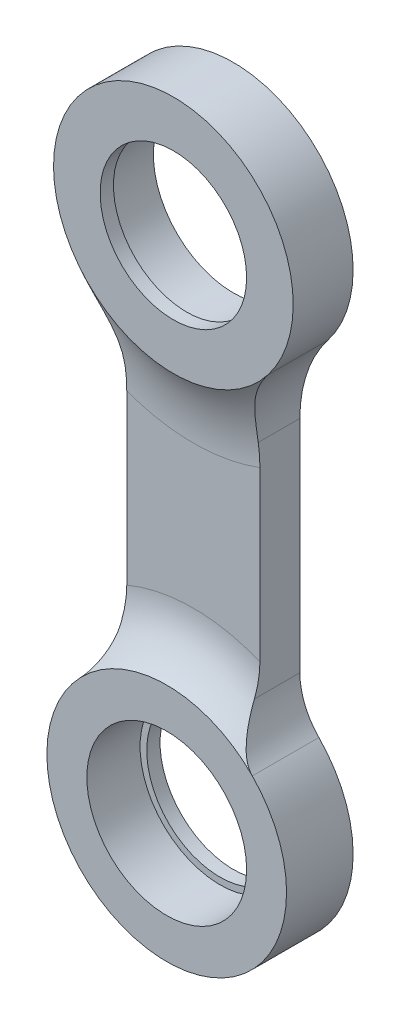
ISO-10303-21;
HEADER;
FILE_DESCRIPTION(('STEP AP214'),'2;1');
FILE_NAME('part.step','',(''),(''),'','','');
FILE_SCHEMA(('AUTOMOTIVE_DESIGN { 1 0 10303 214 1 1 1 1 }'));
ENDSEC;
DATA;
#1=APPLICATION_CONTEXT('core data for automotive mechanical design processes');
#2=APPLICATION_PROTOCOL_DEFINITION('international standard','automotive_design',2000,#1);
#3=PRODUCT_CONTEXT('',#1,'mechanical');
#4=PRODUCT('Part','Part','',(#3));
#5=PRODUCT_RELATED_PRODUCT_CATEGORY('part','',(#4));
#6=PRODUCT_DEFINITION_FORMATION('','',#4);
#7=PRODUCT_DEFINITION_CONTEXT('part definition',#1,'design');
#8=PRODUCT_DEFINITION('design','',#6,#7);
#9=PRODUCT_DEFINITION_SHAPE('','',#8);
#10=(LENGTH_UNIT() NAMED_UNIT(*) SI_UNIT(.MILLI.,.METRE.));
#11=(NAMED_UNIT(*) PLANE_ANGLE_UNIT() SI_UNIT($,.RADIAN.));
#12=(NAMED_UNIT(*) SI_UNIT($,.STERADIAN.) SOLID_ANGLE_UNIT());
#13=UNCERTAINTY_MEASURE_WITH_UNIT(LENGTH_MEASURE(1.E-05),#10,'distance_accuracy_value','');
#14=(GEOMETRIC_REPRESENTATION_CONTEXT(3) GLOBAL_UNCERTAINTY_ASSIGNED_CONTEXT((#13)) GLOBAL_UNIT_ASSIGNED_CONTEXT((#10,
#11,#12)) REPRESENTATION_CONTEXT('',''));
#15=CARTESIAN_POINT('',(0.,0.,0.));
#16=DIRECTION('',(0.,0.,1.));
#17=DIRECTION('',(1.,0.,0.));
#18=AXIS2_PLACEMENT_3D('',#15,#16,#17);
#19=CARTESIAN_POINT('',(0.,0.,3.));
#20=DIRECTION('',(0.,0.,-1.));
#21=DIRECTION('',(-1.,0.,0.));
#22=AXIS2_PLACEMENT_3D('',#19,#20,#21);
#23=CYLINDRICAL_SURFACE('',#22,6.);
#24=CARTESIAN_POINT('',(0.,0.,0.));
#25=DIRECTION('',(0.,0.,1.));
#26=DIRECTION('',(1.,0.,0.));
#27=AXIS2_PLACEMENT_3D('',#24,#25,#26);
#28=CIRCLE('',#27,6.);
#29=CARTESIAN_POINT('',(6.,0.,0.));
#30=VERTEX_POINT('',#29);
#31=EDGE_CURVE('E267',#30,#30,#28,.T.);
#32=ORIENTED_EDGE('',*,*,#31,.F.);
#33=EDGE_LOOP('',(#32));
#34=FACE_BOUND('',#33,.T.);
#35=CARTESIAN_POINT('',(0.,0.,3.5));
#36=DIRECTION('',(0.,0.,1.));
#37=DIRECTION('',(1.,0.,0.));
#38=AXIS2_PLACEMENT_3D('',#35,#36,#37);
#39=CIRCLE('',#38,6.);
#40=CARTESIAN_POINT('',(6.,0.,3.5));
#41=VERTEX_POINT('',#40);
#42=EDGE_CURVE('E247',#41,#41,#39,.T.);
#43=ORIENTED_EDGE('',*,*,#42,.T.);
#44=EDGE_LOOP('',(#43));
#45=FACE_BOUND('',#44,.T.);
#46=ADVANCED_FACE('F37',(#34,#45),#23,.F.);
#47=CARTESIAN_POINT('',(0.,0.,3.));
#48=DIRECTION('',(0.,0.,1.));
#49=DIRECTION('',(1.,0.,0.));
#50=AXIS2_PLACEMENT_3D('',#47,#48,#49);
#51=PLANE('',#50);
#52=DIRECTION('',(0.,1.,0.));
#53=VECTOR('',#52,1.);
#54=CARTESIAN_POINT('',(5.,-7.48331477354788,3.));
#55=LINE('',#54,#53);
#56=CARTESIAN_POINT('',(5.,-26.,3.));
#57=VERTEX_POINT('',#56);
#58=CARTESIAN_POINT('',(5.,-13.3630417112151,3.));
#59=VERTEX_POINT('',#58);
#60=EDGE_CURVE('E128',#57,#59,#55,.T.);
#61=ORIENTED_EDGE('',*,*,#60,.T.);
#62=CARTESIAN_POINT('',(0.,0.,3.));
#63=DIRECTION('',(0.,0.,1.));
#64=DIRECTION('',(1.,0.,0.));
#65=AXIS2_PLACEMENT_3D('',#62,#63,#64);
#66=CIRCLE('',#65,14.2678268764264);
#67=CARTESIAN_POINT('',(-5.,-13.3630417112151,3.));
#68=VERTEX_POINT('',#67);
#69=EDGE_CURVE('E282',#59,#68,#66,.F.);
#70=ORIENTED_EDGE('',*,*,#69,.T.);
#71=DIRECTION('',(0.,-1.,0.));
#72=VECTOR('',#71,1.);
#73=CARTESIAN_POINT('',(-5.,-7.48331477354788,3.));
#74=LINE('',#73,#72);
#75=CARTESIAN_POINT('',(-5.,-26.,3.));
#76=VERTEX_POINT('',#75);
#77=EDGE_CURVE('E148',#68,#76,#74,.T.);
#78=ORIENTED_EDGE('',*,*,#77,.T.);
#79=CARTESIAN_POINT('',(0.,-38.,3.));
#80=DIRECTION('',(0.,0.,1.));
#81=DIRECTION('',(1.,0.,0.));
#82=AXIS2_PLACEMENT_3D('',#79,#80,#81);
#83=CIRCLE('',#82,13.);
#84=EDGE_CURVE('E159',#76,#57,#83,.F.);
#85=ORIENTED_EDGE('',*,*,#84,.T.);
#86=EDGE_LOOP('',(#61,#70,#78,#85));
#87=FACE_BOUND('',#86,.T.);
#88=ADVANCED_FACE('F292',(#87),#51,.T.);
#89=CARTESIAN_POINT('',(0.,-38.,0.));
#90=DIRECTION('',(0.,0.,1.));
#91=DIRECTION('',(1.,0.,0.));
#92=AXIS2_PLACEMENT_3D('',#89,#90,#91);
#93=CYLINDRICAL_SURFACE('',#92,5.5);
#94=CARTESIAN_POINT('',(0.,-38.,0.));
#95=DIRECTION('',(0.,0.,1.));
#96=DIRECTION('',(1.,0.,0.));
#97=AXIS2_PLACEMENT_3D('',#94,#95,#96);
#98=CIRCLE('',#97,5.5);
#99=CARTESIAN_POINT('',(5.5,-38.,0.));
#100=VERTEX_POINT('',#99);
#101=EDGE_CURVE('E261',#100,#100,#98,.T.);
#102=ORIENTED_EDGE('',*,*,#101,.F.);
#103=EDGE_LOOP('',(#102));
#104=FACE_BOUND('',#103,.T.);
#105=CARTESIAN_POINT('',(0.,-38.,1.));
#106=DIRECTION('',(0.,0.,1.));
#107=DIRECTION('',(1.,0.,0.));
#108=AXIS2_PLACEMENT_3D('',#105,#106,#107);
#109=CIRCLE('',#108,5.5);
#110=CARTESIAN_POINT('',(5.5,-38.,1.));
#111=VERTEX_POINT('',#110);
#112=EDGE_CURVE('E258',#111,#111,#109,.F.);
#113=ORIENTED_EDGE('',*,*,#112,.F.);
#114=EDGE_LOOP('',(#113));
#115=FACE_BOUND('',#114,.T.);
#116=ADVANCED_FACE('F290',(#104,#115),#93,.F.);
#117=CARTESIAN_POINT('',(0.,0.,0.));
#118=DIRECTION('',(0.,0.,1.));
#119=DIRECTION('',(1.,0.,0.));
#120=AXIS2_PLACEMENT_3D('',#117,#118,#119);
#121=PLANE('',#120);
#122=ORIENTED_EDGE('',*,*,#101,.T.);
#123=EDGE_LOOP('',(#122));
#124=FACE_BOUND('',#123,.T.);
#125=DIRECTION('',(0.,1.,0.));
#126=VECTOR('',#125,1.);
#127=CARTESIAN_POINT('',(5.,-7.48331477354788,0.));
#128=LINE('',#127,#126);
#129=CARTESIAN_POINT('',(5.,-28.2020410288673,0.));
#130=VERTEX_POINT('',#129);
#131=CARTESIAN_POINT('',(5.,-11.6619037896906,0.));
#132=VERTEX_POINT('',#131);
#133=EDGE_CURVE('E272',#130,#132,#128,.T.);
#134=ORIENTED_EDGE('',*,*,#133,.F.);
#135=CARTESIAN_POINT('',(10.,-28.2020410288673,0.));
#136=DIRECTION('',(0.,0.,1.));
#137=DIRECTION('',(1.,0.,0.));
#138=AXIS2_PLACEMENT_3D('',#135,#136,#137);
#139=CIRCLE('',#138,5.);
#140=CARTESIAN_POINT('',(6.42857142857143,-31.7013120899861,0.));
#141=VERTEX_POINT('',#140);
#142=EDGE_CURVE('E140',#130,#141,#139,.T.);
#143=ORIENTED_EDGE('',*,*,#142,.T.);
#144=CARTESIAN_POINT('',(0.,-38.,0.));
#145=DIRECTION('',(0.,0.,-1.));
#146=DIRECTION('',(-1.,0.,0.));
#147=AXIS2_PLACEMENT_3D('',#144,#145,#146);
#148=CIRCLE('',#147,9.);
#149=CARTESIAN_POINT('',(-6.42857142857143,-31.7013120899861,0.));
#150=VERTEX_POINT('',#149);
#151=EDGE_CURVE('E138',#141,#150,#148,.T.);
#152=ORIENTED_EDGE('',*,*,#151,.T.);
#153=CARTESIAN_POINT('',(-10.,-28.2020410288673,0.));
#154=DIRECTION('',(0.,0.,1.));
#155=DIRECTION('',(1.,0.,0.));
#156=AXIS2_PLACEMENT_3D('',#153,#154,#155);
#157=CIRCLE('',#156,5.);
#158=CARTESIAN_POINT('',(-5.,-28.2020410288673,0.));
#159=VERTEX_POINT('',#158);
#160=EDGE_CURVE('E133',#150,#159,#157,.T.);
#161=ORIENTED_EDGE('',*,*,#160,.T.);
#162=DIRECTION('',(0.,-1.,0.));
#163=VECTOR('',#162,1.);
#164=CARTESIAN_POINT('',(-5.,-7.48331477354788,0.));
#165=LINE('',#164,#163);
#166=CARTESIAN_POINT('',(-5.,-11.6619037896906,0.));
#167=VERTEX_POINT('',#166);
#168=EDGE_CURVE('E120',#167,#159,#165,.T.);
#169=ORIENTED_EDGE('',*,*,#168,.F.);
#170=CARTESIAN_POINT('',(-15.,-11.6619037896906,0.));
#171=DIRECTION('',(0.,0.,1.));
#172=DIRECTION('',(1.,0.,0.));
#173=AXIS2_PLACEMENT_3D('',#170,#171,#172);
#174=CIRCLE('',#173,10.);
#175=CARTESIAN_POINT('',(-7.10526315789474,-5.52405968985344,0.));
#176=VERTEX_POINT('',#175);
#177=EDGE_CURVE('E50',#167,#176,#174,.T.);
#178=ORIENTED_EDGE('',*,*,#177,.T.);
#179=CARTESIAN_POINT('',(0.,0.,0.));
#180=DIRECTION('',(0.,0.,1.));
#181=DIRECTION('',(1.,0.,0.));
#182=AXIS2_PLACEMENT_3D('',#179,#180,#181);
#183=CIRCLE('',#182,9.);
#184=CARTESIAN_POINT('',(7.10526315789474,-5.52405968985344,0.));
#185=VERTEX_POINT('',#184);
#186=EDGE_CURVE('E129',#185,#176,#183,.T.);
#187=ORIENTED_EDGE('',*,*,#186,.F.);
#188=CARTESIAN_POINT('',(15.,-11.6619037896906,0.));
#189=DIRECTION('',(0.,0.,1.));
#190=DIRECTION('',(1.,0.,0.));
#191=AXIS2_PLACEMENT_3D('',#188,#189,#190);
#192=CIRCLE('',#191,10.);
#193=EDGE_CURVE('E11',#185,#132,#192,.T.);
#194=ORIENTED_EDGE('',*,*,#193,.T.);
#195=EDGE_LOOP('',(#134,#143,#152,#161,#169,#178,#187,#194));
#196=FACE_BOUND('',#195,.T.);
#197=ORIENTED_EDGE('',*,*,#31,.T.);
#198=EDGE_LOOP('',(#197));
#199=FACE_BOUND('',#198,.T.);
#200=ADVANCED_FACE('F135',(#124,#196,#199),#121,.F.);
#201=CARTESIAN_POINT('',(5.,-7.48331477354788,3.));
#202=DIRECTION('',(-1.,0.,0.));
#203=DIRECTION('',(0.,-1.,0.));
#204=AXIS2_PLACEMENT_3D('',#201,#202,#203);
#205=PLANE('',#204);
#206=ORIENTED_EDGE('',*,*,#133,.T.);
#207=DIRECTION('',(0.,0.,1.));
#208=VECTOR('',#207,1.);
#209=CARTESIAN_POINT('',(5.,-11.6619037896906,3.));
#210=LINE('',#209,#208);
#211=CARTESIAN_POINT('',(5.,-11.6619037896906,3.12548879514451));
#212=VERTEX_POINT('',#211);
#213=EDGE_CURVE('E66',#132,#212,#210,.T.);
#214=ORIENTED_EDGE('',*,*,#213,.T.);
#215=CARTESIAN_POINT('',(5.,-11.6619037896906,3.12548879514451));
#216=CARTESIAN_POINT('',(5.,-11.8027534116254,3.1047832327524));
#217=CARTESIAN_POINT('',(5.,-11.9439735407425,3.0865795793301));
#218=CARTESIAN_POINT('',(5.,-12.2267889504772,3.05528907455919));
#219=CARTESIAN_POINT('',(5.,-12.3683834822832,3.04219544968718));
#220=CARTESIAN_POINT('',(5.,-12.6519625143613,3.02118205097603));
#221=CARTESIAN_POINT('',(5.,-12.793947028353,3.0132624615626));
#222=CARTESIAN_POINT('',(5.,-13.0783005396914,3.00266703155814));
#223=CARTESIAN_POINT('',(5.,-13.2206697972569,2.99999818906772));
#224=CARTESIAN_POINT('',(5.,-13.3630417112151,3.));
#225=B_SPLINE_CURVE_WITH_KNOTS('',3,(#215,#216,#217,#218,#219,#220,#221,#222,#223,#224),
.UNSPECIFIED.,.F.,.F.,(4,2,2,2,4),(0.,0.427071647913648,0.853575258761427,1.28009407127177,
1.70718095629201),.UNSPECIFIED.);
#226=EDGE_CURVE('E207',#212,#59,#225,.T.);
#227=ORIENTED_EDGE('',*,*,#226,.T.);
#228=ORIENTED_EDGE('',*,*,#60,.F.);
#229=CARTESIAN_POINT('',(5.,-26.,3.));
#230=CARTESIAN_POINT('',(5.,-26.1887063020829,2.99998186817486));
#231=CARTESIAN_POINT('',(5.,-26.3773732138428,3.00910162959403));
#232=CARTESIAN_POINT('',(5.,-26.7514164021473,3.04493550984344));
#233=CARTESIAN_POINT('',(5.,-26.9368070173168,3.07149954153645));
#234=CARTESIAN_POINT('',(5.,-27.3042737694582,3.14154566013053));
#235=CARTESIAN_POINT('',(5.,-27.4863511733735,3.18502113161838));
#236=CARTESIAN_POINT('',(5.,-27.8473656152808,3.28871955313451));
#237=CARTESIAN_POINT('',(5.,-28.0262624147161,3.34908271575913));
#238=CARTESIAN_POINT('',(5.,-28.2020410288673,3.41742430504416));
#239=B_SPLINE_CURVE_WITH_KNOTS('',3,(#229,#230,#231,#232,#233,#234,#235,#236,#237,#238),
.UNSPECIFIED.,.F.,.F.,(4,2,2,2,4),(0.,0.565841470113467,1.12687723453734,1.68769375346242,
2.25331225600449),.UNSPECIFIED.);
#240=CARTESIAN_POINT('',(5.,-28.2020410288673,3.41742430504416));
#241=VERTEX_POINT('',#240);
#242=EDGE_CURVE('E190',#57,#241,#239,.T.);
#243=ORIENTED_EDGE('',*,*,#242,.T.);
#244=DIRECTION('',(0.,0.,-1.));
#245=VECTOR('',#244,1.);
#246=CARTESIAN_POINT('',(5.,-28.2020410288673,3.));
#247=LINE('',#246,#245);
#248=EDGE_CURVE('E141',#241,#130,#247,.T.);
#249=ORIENTED_EDGE('',*,*,#248,.T.);
#250=EDGE_LOOP('',(#206,#214,#227,#228,#243,#249));
#251=FACE_BOUND('',#250,.T.);
#252=ADVANCED_FACE('F200',(#251),#205,.F.);
#253=CARTESIAN_POINT('',(0.,0.,3.));
#254=DIRECTION('',(0.,0.,-1.));
#255=DIRECTION('',(-1.,0.,0.));
#256=AXIS2_PLACEMENT_3D('',#253,#254,#255);
#257=CYLINDRICAL_SURFACE('',#256,9.);
#258=ORIENTED_EDGE('',*,*,#186,.T.);
#259=DIRECTION('',(0.,0.,-1.));
#260=VECTOR('',#259,1.);
#261=CARTESIAN_POINT('',(-7.10526315789474,-5.52405968985344,3.));
#262=LINE('',#261,#260);
#263=CARTESIAN_POINT('',(-7.10526315789474,-5.52405968985344,4.5));
#264=VERTEX_POINT('',#263);
#265=EDGE_CURVE('E277',#176,#264,#262,.F.);
#266=ORIENTED_EDGE('',*,*,#265,.T.);
#267=CARTESIAN_POINT('',(0.,0.,4.5));
#268=DIRECTION('',(0.,0.,1.));
#269=DIRECTION('',(1.,0.,0.));
#270=AXIS2_PLACEMENT_3D('',#267,#268,#269);
#271=CIRCLE('',#270,9.);
#272=CARTESIAN_POINT('',(7.10526315789474,-5.52405968985344,4.5));
#273=VERTEX_POINT('',#272);
#274=EDGE_CURVE('E252',#273,#264,#271,.T.);
#275=ORIENTED_EDGE('',*,*,#274,.F.);
#276=DIRECTION('',(0.,0.,-1.));
#277=VECTOR('',#276,1.);
#278=CARTESIAN_POINT('',(7.10526315789474,-5.52405968985344,3.));
#279=LINE('',#278,#277);
#280=EDGE_CURVE('E280',#273,#185,#279,.T.);
#281=ORIENTED_EDGE('',*,*,#280,.T.);
#282=EDGE_LOOP('',(#258,#266,#275,#281));
#283=FACE_BOUND('',#282,.T.);
#284=ADVANCED_FACE('F204',(#283),#257,.T.);
#285=CARTESIAN_POINT('',(-5.,-7.48331477354788,3.));
#286=DIRECTION('',(1.,0.,0.));
#287=DIRECTION('',(0.,1.,0.));
#288=AXIS2_PLACEMENT_3D('',#285,#286,#287);
#289=PLANE('',#288);
#290=CARTESIAN_POINT('',(-5.,-13.3630417112151,3.));
#291=CARTESIAN_POINT('',(-5.,-13.2206697972569,2.99999818906772));
#292=CARTESIAN_POINT('',(-5.,-13.0783005396914,3.00266703155814));
#293=CARTESIAN_POINT('',(-5.,-12.793947028353,3.0132624615626));
#294=CARTESIAN_POINT('',(-5.,-12.6519625143613,3.02118205097603));
#295=CARTESIAN_POINT('',(-5.,-12.3683834822832,3.04219544968718));
#296=CARTESIAN_POINT('',(-5.,-12.2267889504772,3.05528907455919));
#297=CARTESIAN_POINT('',(-5.,-11.9439735407425,3.0865795793301));
#298=CARTESIAN_POINT('',(-5.,-11.8027534116254,3.1047832327524));
#299=CARTESIAN_POINT('',(-5.,-11.6619037896906,3.12548879514451));
#300=B_SPLINE_CURVE_WITH_KNOTS('',3,(#290,#291,#292,#293,#294,#295,#296,#297,#298,#299),
.UNSPECIFIED.,.F.,.F.,(4,2,2,2,4),(0.,0.427086885020234,0.85360569753058,1.28010930837836,
1.70718095629201),.UNSPECIFIED.);
#301=CARTESIAN_POINT('',(-5.,-11.6619037896906,3.12548879514451));
#302=VERTEX_POINT('',#301);
#303=EDGE_CURVE('E213',#68,#302,#300,.T.);
#304=ORIENTED_EDGE('',*,*,#303,.T.);
#305=DIRECTION('',(0.,0.,1.));
#306=VECTOR('',#305,1.);
#307=CARTESIAN_POINT('',(-5.,-11.6619037896906,0.));
#308=LINE('',#307,#306);
#309=EDGE_CURVE('E58',#302,#167,#308,.F.);
#310=ORIENTED_EDGE('',*,*,#309,.T.);
#311=ORIENTED_EDGE('',*,*,#168,.T.);
#312=DIRECTION('',(0.,0.,-1.));
#313=VECTOR('',#312,1.);
#314=CARTESIAN_POINT('',(-5.,-28.2020410288673,3.));
#315=LINE('',#314,#313);
#316=CARTESIAN_POINT('',(-5.,-28.2020410288673,3.41742430504416));
#317=VERTEX_POINT('',#316);
#318=EDGE_CURVE('E125',#159,#317,#315,.F.);
#319=ORIENTED_EDGE('',*,*,#318,.T.);
#320=CARTESIAN_POINT('',(-5.,-28.2020410288673,3.41742430504416));
#321=CARTESIAN_POINT('',(-5.,-28.0262624147161,3.34908271575913));
#322=CARTESIAN_POINT('',(-5.,-27.8473656152808,3.28871955313451));
#323=CARTESIAN_POINT('',(-5.,-27.4863511733735,3.18502113161838));
#324=CARTESIAN_POINT('',(-5.,-27.3042737694582,3.14154566013053));
#325=CARTESIAN_POINT('',(-5.,-26.9368070173168,3.07149954153645));
#326=CARTESIAN_POINT('',(-5.,-26.7514164021473,3.04493550984344));
#327=CARTESIAN_POINT('',(-5.,-26.3773732138428,3.00910162959403));
#328=CARTESIAN_POINT('',(-5.,-26.1887063020829,2.99998186817486));
#329=CARTESIAN_POINT('',(-5.,-26.,3.));
#330=B_SPLINE_CURVE_WITH_KNOTS('',3,(#320,#321,#322,#323,#324,#325,#326,#327,#328,#329),
.UNSPECIFIED.,.F.,.F.,(4,2,2,2,4),(0.,0.565618502542066,1.12643502146715,1.68747078589103,
2.25331225600449),.UNSPECIFIED.);
#331=EDGE_CURVE('E167',#317,#76,#330,.T.);
#332=ORIENTED_EDGE('',*,*,#331,.T.);
#333=ORIENTED_EDGE('',*,*,#77,.F.);
#334=EDGE_LOOP('',(#304,#310,#311,#319,#332,#333));
#335=FACE_BOUND('',#334,.T.);
#336=ADVANCED_FACE('F122',(#335),#289,.F.);
#337=CARTESIAN_POINT('',(0.,-38.,5.));
#338=DIRECTION('',(0.,0.,-1.));
#339=DIRECTION('',(-1.,0.,0.));
#340=AXIS2_PLACEMENT_3D('',#337,#338,#339);
#341=CYLINDRICAL_SURFACE('',#340,9.);
#342=CARTESIAN_POINT('',(0.,-38.,5.));
#343=DIRECTION('',(0.,0.,-1.));
#344=DIRECTION('',(-1.,0.,0.));
#345=AXIS2_PLACEMENT_3D('',#342,#343,#344);
#346=CIRCLE('',#345,9.);
#347=CARTESIAN_POINT('',(6.42857142857143,-31.7013120899861,5.));
#348=VERTEX_POINT('',#347);
#349=CARTESIAN_POINT('',(-6.42857142857143,-31.7013120899861,5.));
#350=VERTEX_POINT('',#349);
#351=EDGE_CURVE('E268',#348,#350,#346,.T.);
#352=ORIENTED_EDGE('',*,*,#351,.T.);
#353=DIRECTION('',(0.,0.,-1.));
#354=VECTOR('',#353,1.);
#355=CARTESIAN_POINT('',(-6.42857142857143,-31.7013120899861,5.));
#356=LINE('',#355,#354);
#357=EDGE_CURVE('E150',#350,#150,#356,.T.);
#358=ORIENTED_EDGE('',*,*,#357,.T.);
#359=ORIENTED_EDGE('',*,*,#151,.F.);
#360=DIRECTION('',(0.,0.,-1.));
#361=VECTOR('',#360,1.);
#362=CARTESIAN_POINT('',(6.42857142857143,-31.7013120899861,5.));
#363=LINE('',#362,#361);
#364=EDGE_CURVE('E147',#141,#348,#363,.F.);
#365=ORIENTED_EDGE('',*,*,#364,.T.);
#366=EDGE_LOOP('',(#352,#358,#359,#365));
#367=FACE_BOUND('',#366,.T.);
#368=ADVANCED_FACE('F314',(#367),#341,.T.);
#369=CARTESIAN_POINT('',(0.,-38.,5.));
#370=DIRECTION('',(0.,0.,-1.));
#371=DIRECTION('',(-1.,0.,0.));
#372=AXIS2_PLACEMENT_3D('',#369,#370,#371);
#373=PLANE('',#372);
#374=CARTESIAN_POINT('',(0.,-38.,5.));
#375=DIRECTION('',(0.,0.,1.));
#376=DIRECTION('',(1.,0.,0.));
#377=AXIS2_PLACEMENT_3D('',#374,#375,#376);
#378=CIRCLE('',#377,6.);
#379=CARTESIAN_POINT('',(6.,-38.,5.));
#380=VERTEX_POINT('',#379);
#381=EDGE_CURVE('E254',#380,#380,#378,.T.);
#382=ORIENTED_EDGE('',*,*,#381,.F.);
#383=EDGE_LOOP('',(#382));
#384=FACE_BOUND('',#383,.T.);
#385=EDGE_CURVE('E264',#350,#348,#346,.T.);
#386=ORIENTED_EDGE('',*,*,#385,.F.);
#387=ORIENTED_EDGE('',*,*,#351,.F.);
#388=EDGE_LOOP('',(#386,#387));
#389=FACE_BOUND('',#388,.T.);
#390=ADVANCED_FACE('F322',(#384,#389),#373,.F.);
#391=CARTESIAN_POINT('',(-10.,-28.2020410288673,5.));
#392=DIRECTION('',(0.,0.,-1.));
#393=DIRECTION('',(-1.,0.,0.));
#394=AXIS2_PLACEMENT_3D('',#391,#392,#393);
#395=CYLINDRICAL_SURFACE('',#394,5.);
#396=ORIENTED_EDGE('',*,*,#160,.F.);
#397=ORIENTED_EDGE('',*,*,#357,.F.);
#398=CARTESIAN_POINT('',(-6.42857142857143,-31.7013120899861,5.));
#399=CARTESIAN_POINT('',(-6.37358287979229,-31.6452199324288,5.00009255875805));
#400=CARTESIAN_POINT('',(-6.31999316555143,-31.5878515402232,4.99616263016215));
#401=CARTESIAN_POINT('',(-6.21617413277537,-31.4713940646933,4.98100471879076));
#402=CARTESIAN_POINT('',(-6.16593456004301,-31.4123111094403,4.96980025066282));
#403=CARTESIAN_POINT('',(-6.06991587307155,-31.2939914075628,4.94109928583694));
#404=CARTESIAN_POINT('',(-6.02407145333821,-31.2347777105917,4.92372297872827));
#405=CARTESIAN_POINT('',(-5.93585874054629,-31.1155029237745,4.8836845997585));
#406=CARTESIAN_POINT('',(-5.89349355654253,-31.0554411310364,4.86101786836758));
#407=CARTESIAN_POINT('',(-5.78883795132164,-30.9000504859576,4.7972123838911));
#408=CARTESIAN_POINT('',(-5.7290938027862,-30.8042966553384,4.75294542941074));
#409=CARTESIAN_POINT('',(-5.61750237884695,-30.6116316066837,4.6575851380808));
#410=CARTESIAN_POINT('',(-5.56566013859938,-30.5147196927655,4.60648748725635));
#411=CARTESIAN_POINT('',(-5.46853336904432,-30.3181676432745,4.49951193089429));
#412=CARTESIAN_POINT('',(-5.42335177419577,-30.2185083069704,4.44357671424051));
#413=CARTESIAN_POINT('',(-5.33993124553561,-30.0174217949906,4.32972754852922));
#414=CARTESIAN_POINT('',(-5.30169393609513,-29.9159942117612,4.27181314026409));
#415=CARTESIAN_POINT('',(-5.22316415255313,-29.6853404990528,4.14115730971522));
#416=CARTESIAN_POINT('',(-5.18475517004439,-29.5555139726297,4.06833495950642));
#417=CARTESIAN_POINT('',(-5.11837104411819,-29.2920571458386,3.92492022757315));
#418=CARTESIAN_POINT('',(-5.09039301351288,-29.1584279090632,3.85432723374309));
#419=CARTESIAN_POINT('',(-5.04570127319535,-28.8898475469548,3.71900502846898));
#420=CARTESIAN_POINT('',(-5.02876848262085,-28.7549796242929,3.65418529966102));
#421=CARTESIAN_POINT('',(-5.0059226546989,-28.4813398609123,3.53068064957994));
#422=CARTESIAN_POINT('',(-5.00002547638049,-28.3425626923585,3.4720046714101));
#423=CARTESIAN_POINT('',(-5.,-28.2020410288673,3.41742430504416));
#424=B_SPLINE_CURVE_WITH_KNOTS('',3,(#398,#399,#400,#401,#402,#403,#404,#405,#406,#407,#408,
#409,#410,#411,#412,#413,#414,#415,#416,#417,#418,#419,#420,#421,#422,#423),.UNSPECIFIED.,.F.,
.F.,(4,2,2,2,2,2,2,2,2,2,2,2,4),(0.,0.235421351486667,0.47008547669821,0.700409983536515,
0.930938118829272,1.29399026532667,1.657272792902,2.02568503121129,2.39418333590944,
2.85496696755885,3.31562296384641,3.7668391523432,4.21870327694747),.UNSPECIFIED.);
#425=EDGE_CURVE('E145',#350,#317,#424,.T.);
#426=ORIENTED_EDGE('',*,*,#425,.T.);
#427=ORIENTED_EDGE('',*,*,#318,.F.);
#428=EDGE_LOOP('',(#396,#397,#426,#427));
#429=FACE_BOUND('',#428,.T.);
#430=ADVANCED_FACE('F143',(#429),#395,.F.);
#431=CARTESIAN_POINT('',(10.,-28.2020410288673,5.));
#432=DIRECTION('',(0.,0.,-1.));
#433=DIRECTION('',(-1.,0.,0.));
#434=AXIS2_PLACEMENT_3D('',#431,#432,#433);
#435=CYLINDRICAL_SURFACE('',#434,5.);
#436=ORIENTED_EDGE('',*,*,#248,.F.);
#437=CARTESIAN_POINT('',(5.,-28.2020410288673,3.41742430504416));
#438=CARTESIAN_POINT('',(5.00000140180776,-28.2792560336286,3.44743868702474));
#439=CARTESIAN_POINT('',(5.00178838408801,-28.3559692291301,3.47867845781272));
#440=CARTESIAN_POINT('',(5.00880580838056,-28.5082993255423,3.54329349990528));
#441=CARTESIAN_POINT('',(5.01403494784572,-28.5839166300914,3.57666795911081));
#442=CARTESIAN_POINT('',(5.03467330213181,-28.8088222964375,3.67944192440776));
#443=CARTESIAN_POINT('',(5.05503432328293,-28.9564224946388,3.75159421016264));
#444=CARTESIAN_POINT('',(5.10826302911059,-29.2474599775327,3.90086850577534));
#445=CARTESIAN_POINT('',(5.14118104778541,-29.3908779744739,3.9780094652168));
#446=CARTESIAN_POINT('',(5.21914116968395,-29.673394349654,4.1341148401959));
#447=CARTESIAN_POINT('',(5.26418484861641,-29.8124921638705,4.21307949149912));
#448=CARTESIAN_POINT('',(5.3460532776506,-30.0319180731513,4.33784151021828));
#449=CARTESIAN_POINT('',(5.37891320591439,-30.1134125513693,4.38422238951071));
#450=CARTESIAN_POINT('',(5.44924638319661,-30.2753079437793,4.47535307677275));
#451=CARTESIAN_POINT('',(5.48671880162132,-30.3557090519725,4.52010317652925));
#452=CARTESIAN_POINT('',(5.56653150702769,-30.5155499642308,4.60673933765655));
#453=CARTESIAN_POINT('',(5.60886720594907,-30.5949905974578,4.64862803994585));
#454=CARTESIAN_POINT('',(5.69876174141585,-30.7530458975424,4.72804227504222));
#455=CARTESIAN_POINT('',(5.74631890833315,-30.8316608196721,4.76556919472661));
#456=CARTESIAN_POINT('',(5.8699790597459,-31.0235937957157,4.8499842057733));
#457=CARTESIAN_POINT('',(5.94926126906323,-31.1365177920429,4.89342413451272));
#458=CARTESIAN_POINT('',(6.07721765179618,-31.3031164717482,4.94341622577836));
#459=CARTESIAN_POINT('',(6.12129039844747,-31.3580911216481,4.9575407625198));
#460=CARTESIAN_POINT('',(6.21233144856928,-31.4667888643723,4.98001492768667));
#461=CARTESIAN_POINT('',(6.25929739472774,-31.5205129282236,4.98836919154973));
#462=CARTESIAN_POINT('',(6.32729052985029,-31.5949846342674,4.99571078925129));
#463=CARTESIAN_POINT('',(6.34725704276885,-31.6164708213374,4.99731622892798));
#464=CARTESIAN_POINT('',(6.38760970171853,-31.6591349960432,4.9994616985009));
#465=CARTESIAN_POINT('',(6.40799619790109,-31.680312699118,5.00000079976676));
#466=CARTESIAN_POINT('',(6.42857142857143,-31.7013120899861,5.));
#467=B_SPLINE_CURVE_WITH_KNOTS('',3,(#437,#438,#439,#440,#441,#442,#443,#444,#445,#446,#447,
#448,#449,#450,#451,#452,#453,#454,#455,#456,#457,#458,#459,#460,#461,#462,#463,#464,#465,#466),
.UNSPECIFIED.,.F.,.F.,(4,2,2,2,2,2,2,2,2,2,2,2,2,2,4),(0.,0.248460316357914,0.496826666822465,
0.992730259262558,1.49064290345221,1.98862028179576,2.28659598583944,2.58451811022155,
2.88216144550746,3.17970988137751,3.61190166301041,3.8272458995718,4.04241694165188,
4.13052259997648,4.21870495218253),.UNSPECIFIED.);
#468=EDGE_CURVE('E195',#241,#348,#467,.T.);
#469=ORIENTED_EDGE('',*,*,#468,.T.);
#470=ORIENTED_EDGE('',*,*,#364,.F.);
#471=ORIENTED_EDGE('',*,*,#142,.F.);
#472=EDGE_LOOP('',(#436,#469,#470,#471));
#473=FACE_BOUND('',#472,.T.);
#474=ADVANCED_FACE('F181',(#473),#435,.F.);
#475=CARTESIAN_POINT('',(0.,-38.,8.));
#476=DIRECTION('',(0.,0.,1.));
#477=DIRECTION('',(1.,0.,0.));
#478=AXIS2_PLACEMENT_3D('',#475,#476,#477);
#479=TOROIDAL_SURFACE('',#478,13.,5.);
#480=ORIENTED_EDGE('',*,*,#242,.F.);
#481=ORIENTED_EDGE('',*,*,#84,.F.);
#482=ORIENTED_EDGE('',*,*,#331,.F.);
#483=ORIENTED_EDGE('',*,*,#425,.F.);
#484=ORIENTED_EDGE('',*,*,#385,.T.);
#485=ORIENTED_EDGE('',*,*,#468,.F.);
#486=EDGE_LOOP('',(#480,#481,#482,#483,#484,#485));
#487=FACE_BOUND('',#486,.T.);
#488=ADVANCED_FACE('F176',(#487),#479,.F.);
#489=CARTESIAN_POINT('',(0.,-38.,1.));
#490=DIRECTION('',(0.,0.,1.));
#491=DIRECTION('',(1.,0.,0.));
#492=AXIS2_PLACEMENT_3D('',#489,#490,#491);
#493=PLANE('',#492);
#494=CARTESIAN_POINT('',(0.,-38.,1.));
#495=DIRECTION('',(0.,0.,1.));
#496=DIRECTION('',(1.,0.,0.));
#497=AXIS2_PLACEMENT_3D('',#494,#495,#496);
#498=CIRCLE('',#497,6.);
#499=CARTESIAN_POINT('',(6.,-38.,1.));
#500=VERTEX_POINT('',#499);
#501=EDGE_CURVE('E255',#500,#500,#498,.T.);
#502=ORIENTED_EDGE('',*,*,#501,.T.);
#503=EDGE_LOOP('',(#502));
#504=FACE_BOUND('',#503,.T.);
#505=ORIENTED_EDGE('',*,*,#112,.T.);
#506=EDGE_LOOP('',(#505));
#507=FACE_BOUND('',#506,.T.);
#508=ADVANCED_FACE('F180',(#504,#507),#493,.T.);
#509=CARTESIAN_POINT('',(0.,-38.,1.));
#510=DIRECTION('',(0.,0.,1.));
#511=DIRECTION('',(1.,0.,0.));
#512=AXIS2_PLACEMENT_3D('',#509,#510,#511);
#513=CYLINDRICAL_SURFACE('',#512,6.);
#514=ORIENTED_EDGE('',*,*,#501,.F.);
#515=EDGE_LOOP('',(#514));
#516=FACE_BOUND('',#515,.T.);
#517=ORIENTED_EDGE('',*,*,#381,.T.);
#518=EDGE_LOOP('',(#517));
#519=FACE_BOUND('',#518,.T.);
#520=ADVANCED_FACE('F379',(#516,#519),#513,.F.);
#521=CARTESIAN_POINT('',(0.,0.,4.5));
#522=DIRECTION('',(0.,0.,1.));
#523=DIRECTION('',(1.,0.,0.));
#524=AXIS2_PLACEMENT_3D('',#521,#522,#523);
#525=PLANE('',#524);
#526=EDGE_CURVE('E238',#264,#273,#271,.T.);
#527=ORIENTED_EDGE('',*,*,#526,.T.);
#528=ORIENTED_EDGE('',*,*,#274,.T.);
#529=EDGE_LOOP('',(#527,#528));
#530=FACE_BOUND('',#529,.T.);
#531=CARTESIAN_POINT('',(0.,0.,4.5));
#532=DIRECTION('',(0.,0.,1.));
#533=DIRECTION('',(1.,0.,0.));
#534=AXIS2_PLACEMENT_3D('',#531,#532,#533);
#535=CIRCLE('',#534,5.5);
#536=CARTESIAN_POINT('',(5.5,0.,4.5));
#537=VERTEX_POINT('',#536);
#538=EDGE_CURVE('E240',#537,#537,#535,.T.);
#539=ORIENTED_EDGE('',*,*,#538,.F.);
#540=EDGE_LOOP('',(#539));
#541=FACE_BOUND('',#540,.T.);
#542=ADVANCED_FACE('F365',(#530,#541),#525,.T.);
#543=CARTESIAN_POINT('',(0.,0.,3.5));
#544=DIRECTION('',(0.,0.,1.));
#545=DIRECTION('',(1.,0.,0.));
#546=AXIS2_PLACEMENT_3D('',#543,#544,#545);
#547=PLANE('',#546);
#548=CARTESIAN_POINT('',(0.,0.,3.5));
#549=DIRECTION('',(0.,0.,1.));
#550=DIRECTION('',(1.,0.,0.));
#551=AXIS2_PLACEMENT_3D('',#548,#549,#550);
#552=CIRCLE('',#551,5.5);
#553=CARTESIAN_POINT('',(5.5,0.,3.5));
#554=VERTEX_POINT('',#553);
#555=EDGE_CURVE('E242',#554,#554,#552,.T.);
#556=ORIENTED_EDGE('',*,*,#555,.T.);
#557=EDGE_LOOP('',(#556));
#558=FACE_BOUND('',#557,.T.);
#559=ORIENTED_EDGE('',*,*,#42,.F.);
#560=EDGE_LOOP('',(#559));
#561=FACE_BOUND('',#560,.T.);
#562=ADVANCED_FACE('F354',(#558,#561),#547,.F.);
#563=CARTESIAN_POINT('',(0.,0.,3.5));
#564=DIRECTION('',(0.,0.,1.));
#565=DIRECTION('',(1.,0.,0.));
#566=AXIS2_PLACEMENT_3D('',#563,#564,#565);
#567=CYLINDRICAL_SURFACE('',#566,5.5);
#568=ORIENTED_EDGE('',*,*,#555,.F.);
#569=EDGE_LOOP('',(#568));
#570=FACE_BOUND('',#569,.T.);
#571=ORIENTED_EDGE('',*,*,#538,.T.);
#572=EDGE_LOOP('',(#571));
#573=FACE_BOUND('',#572,.T.);
#574=ADVANCED_FACE('F349',(#570,#573),#567,.F.);
#575=CARTESIAN_POINT('',(-15.,-11.6619037896906,3.));
#576=DIRECTION('',(0.,0.,-1.));
#577=DIRECTION('',(-1.,0.,0.));
#578=AXIS2_PLACEMENT_3D('',#575,#576,#577);
#579=CYLINDRICAL_SURFACE('',#578,10.);
#580=ORIENTED_EDGE('',*,*,#309,.F.);
#581=CARTESIAN_POINT('',(-5.,-11.6619037896906,3.12548879514451));
#582=CARTESIAN_POINT('',(-4.99999791366206,-11.5280743610185,3.14515087058053));
#583=CARTESIAN_POINT('',(-5.00268640101095,-11.3945712508337,3.16691899907851));
#584=CARTESIAN_POINT('',(-5.013350128544,-11.1284841691627,3.21422351903009));
#585=CARTESIAN_POINT('',(-5.02132383904462,-10.9958999429431,3.23975881850267));
#586=CARTESIAN_POINT('',(-5.04244592583826,-10.732061764668,3.29411991060437));
#587=CARTESIAN_POINT('',(-5.05558556568652,-10.6008059484723,3.32294008982638));
#588=CARTESIAN_POINT('',(-5.08694224303899,-10.3395591262534,3.38340765912368));
#589=CARTESIAN_POINT('',(-5.10515965040251,-10.2095682130785,3.41505525503092));
#590=CARTESIAN_POINT('',(-5.16775187792296,-9.81880267125391,3.51418050158469));
#591=CARTESIAN_POINT('',(-5.21983256364472,-9.56013101272061,3.58522309290045));
#592=CARTESIAN_POINT('',(-5.3438545609082,-9.04883384152498,3.73169758666578));
#593=CARTESIAN_POINT('',(-5.41580272777851,-8.79621044858932,3.80713099707613));
#594=CARTESIAN_POINT('',(-5.56488187779756,-8.34149597300606,3.94300703147862));
#595=CARTESIAN_POINT('',(-5.63879878235347,-8.13842954831712,4.00372337979498));
#596=CARTESIAN_POINT('',(-5.80021491048331,-7.73623128083736,4.1200932019623));
#597=CARTESIAN_POINT('',(-5.88771417483231,-7.53709944986046,4.17574666061335));
#598=CARTESIAN_POINT('',(-6.07587735965389,-7.14448777582147,4.27718588744683));
#599=CARTESIAN_POINT('',(-6.17643507837534,-6.95097628215997,4.32304411732935));
#600=CARTESIAN_POINT('',(-6.39129927833767,-6.56894866321051,4.40090476616172));
#601=CARTESIAN_POINT('',(-6.50559285265844,-6.38042804842355,4.43292006455223));
#602=CARTESIAN_POINT('',(-6.70126012789761,-6.08072072268349,4.47047496070506));
#603=CARTESIAN_POINT('',(-6.77852259412442,-5.96751250464139,4.48145678800676));
#604=CARTESIAN_POINT('',(-6.93816688391834,-5.74363822655629,4.49626248921114));
#605=CARTESIAN_POINT('',(-7.02056698705391,-5.63298341768515,4.50005909747289));
#606=CARTESIAN_POINT('',(-7.10526315789474,-5.52405968985344,4.5));
#607=B_SPLINE_CURVE_WITH_KNOTS('',3,(#581,#582,#583,#584,#585,#586,#587,#588,#589,#590,#591,
#592,#593,#594,#595,#596,#597,#598,#599,#600,#601,#602,#603,#604,#605,#606),.UNSPECIFIED.,.F.,
.F.,(4,2,2,2,2,2,2,2,2,2,2,2,4),(0.,0.40573007718395,0.811342776584703,1.21627244796138,
1.62123162170408,2.44003054969125,3.25911236028611,3.93208055470055,4.60505076944548,
5.27285552882233,5.94003761975249,6.35225254284902,6.76602857947533),.UNSPECIFIED.);
#608=EDGE_CURVE('E42',#264,#302,#607,.F.);
#609=ORIENTED_EDGE('',*,*,#608,.F.);
#610=ORIENTED_EDGE('',*,*,#265,.F.);
#611=ORIENTED_EDGE('',*,*,#177,.F.);
#612=EDGE_LOOP('',(#580,#609,#610,#611));
#613=FACE_BOUND('',#612,.T.);
#614=ADVANCED_FACE('F39',(#613),#579,.F.);
#615=CARTESIAN_POINT('',(15.,-11.6619037896906,3.));
#616=DIRECTION('',(0.,0.,-1.));
#617=DIRECTION('',(-1.,0.,0.));
#618=AXIS2_PLACEMENT_3D('',#615,#616,#617);
#619=CYLINDRICAL_SURFACE('',#618,10.);
#620=ORIENTED_EDGE('',*,*,#193,.F.);
#621=ORIENTED_EDGE('',*,*,#280,.F.);
#622=CARTESIAN_POINT('',(7.10526315789474,-5.52405968985344,4.5));
#623=CARTESIAN_POINT('',(7.04136384122423,-5.60624293639861,4.50002203227408));
#624=CARTESIAN_POINT('',(6.97875861597966,-5.68942303456735,4.49787371990528));
#625=CARTESIAN_POINT('',(6.85628754368818,-5.85753151211374,4.4894001804085));
#626=CARTESIAN_POINT('',(6.79642088864199,-5.94245936496368,4.48307619389974));
#627=CARTESIAN_POINT('',(6.67972178052793,-6.11360048120976,4.46644080712337));
#628=CARTESIAN_POINT('',(6.62288047062241,-6.19980892588516,4.45614186813112));
#629=CARTESIAN_POINT('',(6.51211840351413,-6.373569033004,4.43185678422123));
#630=CARTESIAN_POINT('',(6.4581978404138,-6.46112078422386,4.41787039461026));
#631=CARTESIAN_POINT('',(6.3012271725653,-6.7249878261462,4.37101521128653));
#632=CARTESIAN_POINT('',(6.20258681630528,-6.90307524428792,4.33319161083412));
#633=CARTESIAN_POINT('',(6.01714132367505,-7.26311623194139,4.24772980126451));
#634=CARTESIAN_POINT('',(5.93034744649853,-7.44507329206051,4.20008236179953));
#635=CARTESIAN_POINT('',(5.73283536930607,-7.89318764026964,4.07627862604467));
#636=CARTESIAN_POINT('',(5.62837805951302,-8.16118886424914,3.99679896173057));
#637=CARTESIAN_POINT('',(5.44305410302433,-8.70434343145241,3.83465068949975));
#638=CARTESIAN_POINT('',(5.36219780815712,-8.97949985562082,3.75198070019481));
#639=CARTESIAN_POINT('',(5.22423268206351,-9.53667637760159,3.5915869039258));
#640=CARTESIAN_POINT('',(5.16708787301988,-9.81868538446814,3.51385575608522));
#641=CARTESIAN_POINT('',(5.07711862393221,-10.3892557944109,3.36985931507009));
#642=CARTESIAN_POINT('',(5.04426674535879,-10.6778094244198,3.30358115097595));
#643=CARTESIAN_POINT('',(5.01606719443544,-11.0836719375634,3.22287810794682));
#644=CARTESIAN_POINT('',(5.0100548618688,-11.1989048961181,3.20135120176696));
#645=CARTESIAN_POINT('',(5.00202190638251,-11.429974712197,3.16118845875296));
#646=CARTESIAN_POINT('',(5.00000007599289,-11.545811376408,3.14255174895918));
#647=CARTESIAN_POINT('',(4.99999999999998,-11.6619037896906,3.12548879514449));
#648=B_SPLINE_CURVE_WITH_KNOTS('',3,(#622,#623,#624,#625,#626,#627,#628,#629,#630,#631,#632,
#633,#634,#635,#636,#637,#638,#639,#640,#641,#642,#643,#644,#645,#646,#647),.UNSPECIFIED.,.F.,
.F.,(4,2,2,2,2,2,2,2,2,2,2,2,4),(0.,0.31225887652147,0.624425020673373,0.935620386077224,
1.24683640710753,1.86723521311307,2.4882196159405,3.38225117029473,4.27667427568192,
5.16973525161052,6.06178598030468,6.41383955087986,6.76578657864231),.UNSPECIFIED.);
#649=EDGE_CURVE('E225',#212,#273,#648,.F.);
#650=ORIENTED_EDGE('',*,*,#649,.F.);
#651=ORIENTED_EDGE('',*,*,#213,.F.);
#652=EDGE_LOOP('',(#620,#621,#650,#651));
#653=FACE_BOUND('',#652,.T.);
#654=ADVANCED_FACE('F184',(#653),#619,.F.);
#655=CARTESIAN_POINT('',(0.,0.,13.));
#656=DIRECTION('',(0.,0.,1.));
#657=DIRECTION('',(1.,0.,0.));
#658=AXIS2_PLACEMENT_3D('',#655,#656,#657);
#659=TOROIDAL_SURFACE('',#658,14.2678268764264,10.);
#660=ORIENTED_EDGE('',*,*,#303,.F.);
#661=ORIENTED_EDGE('',*,*,#69,.F.);
#662=ORIENTED_EDGE('',*,*,#226,.F.);
#663=ORIENTED_EDGE('',*,*,#649,.T.);
#664=ORIENTED_EDGE('',*,*,#526,.F.);
#665=ORIENTED_EDGE('',*,*,#608,.T.);
#666=EDGE_LOOP('',(#660,#661,#662,#663,#664,#665));
#667=FACE_BOUND('',#666,.T.);
#668=ADVANCED_FACE('F219',(#667),#659,.F.);
#669=CLOSED_SHELL('',(#46,#88,#116,#200,#252,#284,#336,#368,#390,#430,#474,#488,#508,#520,#542,
#562,#574,#614,#654,#668));
#670=MANIFOLD_SOLID_BREP('B2',#669);
#671=ADVANCED_BREP_SHAPE_REPRESENTATION('',(#18,#670),#14);
#672=SHAPE_DEFINITION_REPRESENTATION(#9,#671);
ENDSEC;
END-ISO-10303-21;
